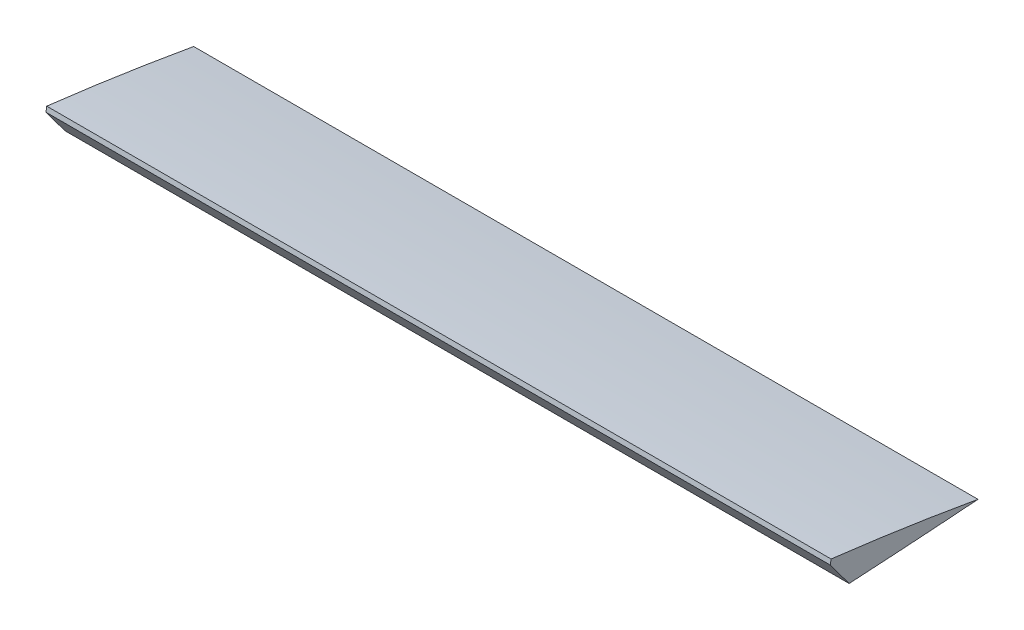
ISO-10303-21;
HEADER;
FILE_DESCRIPTION(('STEP AP214'),'2;1');
FILE_NAME('part.step','',(''),(''),'','','');
FILE_SCHEMA(('AUTOMOTIVE_DESIGN { 1 0 10303 214 1 1 1 1 }'));
ENDSEC;
DATA;
#1=APPLICATION_CONTEXT('core data for automotive mechanical design processes');
#2=APPLICATION_PROTOCOL_DEFINITION('international standard','automotive_design',2000,#1);
#3=PRODUCT_CONTEXT('',#1,'mechanical');
#4=PRODUCT('Part','Part','',(#3));
#5=PRODUCT_RELATED_PRODUCT_CATEGORY('part','',(#4));
#6=PRODUCT_DEFINITION_FORMATION('','',#4);
#7=PRODUCT_DEFINITION_CONTEXT('part definition',#1,'design');
#8=PRODUCT_DEFINITION('design','',#6,#7);
#9=PRODUCT_DEFINITION_SHAPE('','',#8);
#10=(LENGTH_UNIT() NAMED_UNIT(*) SI_UNIT(.MILLI.,.METRE.));
#11=(NAMED_UNIT(*) PLANE_ANGLE_UNIT() SI_UNIT($,.RADIAN.));
#12=(NAMED_UNIT(*) SI_UNIT($,.STERADIAN.) SOLID_ANGLE_UNIT());
#13=UNCERTAINTY_MEASURE_WITH_UNIT(LENGTH_MEASURE(1.E-05),#10,'distance_accuracy_value','');
#14=(GEOMETRIC_REPRESENTATION_CONTEXT(3) GLOBAL_UNCERTAINTY_ASSIGNED_CONTEXT((#13)) GLOBAL_UNIT_ASSIGNED_CONTEXT((#10,
#11,#12)) REPRESENTATION_CONTEXT('',''));
#15=CARTESIAN_POINT('',(0.,0.,0.));
#16=DIRECTION('',(0.,0.,1.));
#17=DIRECTION('',(1.,0.,0.));
#18=AXIS2_PLACEMENT_3D('',#15,#16,#17);
#19=CARTESIAN_POINT('',(-187.325,3467.35220178004,189.415651011113));
#20=DIRECTION('',(1.,0.,0.));
#21=DIRECTION('',(0.,0.,-1.));
#22=AXIS2_PLACEMENT_3D('',#19,#20,#21);
#23=CYLINDRICAL_SURFACE('',#22,3487.44198261828);
#24=CARTESIAN_POINT('',(187.325,3467.35220178004,189.415651011113));
#25=DIRECTION('',(-1.,0.,0.));
#26=DIRECTION('',(0.,0.,1.));
#27=AXIS2_PLACEMENT_3D('',#24,#25,#26);
#28=CIRCLE('',#27,3487.44198261828);
#29=CARTESIAN_POINT('',(187.325,-10.4138152048303,-70.1900369729345));
#30=VERTEX_POINT('',#29);
#31=CARTESIAN_POINT('',(187.325,-14.4619784667253,-8.62877925903338));
#32=VERTEX_POINT('',#31);
#33=EDGE_CURVE('E89',#30,#32,#28,.T.);
#34=ORIENTED_EDGE('',*,*,#33,.T.);
#35=DIRECTION('',(1.,0.,0.));
#36=VECTOR('',#35,1.);
#37=CARTESIAN_POINT('',(-187.325,-14.4619784667248,-8.62877925903316));
#38=LINE('',#37,#36);
#39=CARTESIAN_POINT('',(-187.325,-14.4619784667248,-8.62877925903316));
#40=VERTEX_POINT('',#39);
#41=EDGE_CURVE('E54',#40,#32,#38,.T.);
#42=ORIENTED_EDGE('',*,*,#41,.F.);
#43=CARTESIAN_POINT('',(-187.325,3467.35220178004,189.415651011113));
#44=DIRECTION('',(-1.,0.,0.));
#45=DIRECTION('',(0.,0.,1.));
#46=AXIS2_PLACEMENT_3D('',#43,#44,#45);
#47=CIRCLE('',#46,3487.44198261828);
#48=CARTESIAN_POINT('',(-187.325,-10.4138152048303,-70.1900369729345));
#49=VERTEX_POINT('',#48);
#50=EDGE_CURVE('E84',#49,#40,#47,.T.);
#51=ORIENTED_EDGE('',*,*,#50,.F.);
#52=DIRECTION('',(1.,0.,0.));
#53=VECTOR('',#52,1.);
#54=CARTESIAN_POINT('',(-187.325,-10.4138152048303,-70.1900369729345));
#55=LINE('',#54,#53);
#56=EDGE_CURVE('E47',#49,#30,#55,.T.);
#57=ORIENTED_EDGE('',*,*,#56,.T.);
#58=EDGE_LOOP('',(#34,#42,#51,#57));
#59=FACE_BOUND('',#58,.T.);
#60=ADVANCED_FACE('F39',(#59),#23,.T.);
#61=CARTESIAN_POINT('',(-187.325,0.,0.));
#62=DIRECTION('',(0.,-0.146759519125399,-0.989172201159172));
#63=DIRECTION('',(0.,0.989172201159172,-0.146759519125399));
#64=AXIS2_PLACEMENT_3D('',#61,#62,#63);
#65=PLANE('',#64);
#66=DIRECTION('',(0.,0.989172201159172,-0.146759519125399));
#67=VECTOR('',#66,1.);
#68=CARTESIAN_POINT('',(-187.325,0.,0.));
#69=LINE('',#68,#67);
#70=CARTESIAN_POINT('',(-187.325,-2.35546630401006,0.349471104917352));
#71=VERTEX_POINT('',#70);
#72=CARTESIAN_POINT('',(-187.325,2.22044604925031E-13,0.));
#73=VERTEX_POINT('',#72);
#74=EDGE_CURVE('E105',#71,#73,#69,.T.);
#75=ORIENTED_EDGE('',*,*,#74,.F.);
#76=DIRECTION('',(1.,0.,0.));
#77=VECTOR('',#76,1.);
#78=CARTESIAN_POINT('',(-187.325,-2.35546630401006,0.349471104917352));
#79=LINE('',#78,#77);
#80=CARTESIAN_POINT('',(187.325,-2.35546630401006,0.349471104917352));
#81=VERTEX_POINT('',#80);
#82=EDGE_CURVE('E94',#71,#81,#79,.T.);
#83=ORIENTED_EDGE('',*,*,#82,.T.);
#84=DIRECTION('',(0.,0.989172201159172,-0.146759519125399));
#85=VECTOR('',#84,1.);
#86=CARTESIAN_POINT('',(187.325,0.,0.));
#87=LINE('',#86,#85);
#88=CARTESIAN_POINT('',(187.325,2.22044604925031E-13,0.));
#89=VERTEX_POINT('',#88);
#90=EDGE_CURVE('E85',#81,#89,#87,.T.);
#91=ORIENTED_EDGE('',*,*,#90,.T.);
#92=DIRECTION('',(1.,0.,0.));
#93=VECTOR('',#92,1.);
#94=CARTESIAN_POINT('',(-187.325,2.22044604925031E-13,0.));
#95=LINE('',#94,#93);
#96=EDGE_CURVE('E11',#73,#89,#95,.T.);
#97=ORIENTED_EDGE('',*,*,#96,.F.);
#98=EDGE_LOOP('',(#75,#83,#91,#97));
#99=FACE_BOUND('',#98,.T.);
#100=ADVANCED_FACE('F120',(#99),#65,.F.);
#101=CARTESIAN_POINT('',(-187.325,-1235.91978924871,147.500932055786));
#102=DIRECTION('',(1.,0.,0.));
#103=DIRECTION('',(0.,0.,-1.));
#104=AXIS2_PLACEMENT_3D('',#101,#102,#103);
#105=CYLINDRICAL_SURFACE('',#104,1244.69042352462);
#106=CARTESIAN_POINT('',(187.325,-1235.91978924871,147.500932055786));
#107=DIRECTION('',(-1.,0.,0.));
#108=DIRECTION('',(0.,0.,-1.));
#109=AXIS2_PLACEMENT_3D('',#106,#107,#108);
#110=CIRCLE('',#109,1244.69042352462);
#111=EDGE_CURVE('E75',#89,#30,#110,.T.);
#112=ORIENTED_EDGE('',*,*,#111,.T.);
#113=ORIENTED_EDGE('',*,*,#56,.F.);
#114=CARTESIAN_POINT('',(-187.325,-1235.91978924871,147.500932055786));
#115=DIRECTION('',(-1.,0.,0.));
#116=DIRECTION('',(0.,0.,-1.));
#117=AXIS2_PLACEMENT_3D('',#114,#115,#116);
#118=CIRCLE('',#117,1244.69042352462);
#119=EDGE_CURVE('E63',#73,#49,#118,.T.);
#120=ORIENTED_EDGE('',*,*,#119,.F.);
#121=ORIENTED_EDGE('',*,*,#96,.T.);
#122=EDGE_LOOP('',(#112,#113,#120,#121));
#123=FACE_BOUND('',#122,.T.);
#124=ADVANCED_FACE('F77',(#123),#105,.T.);
#125=CARTESIAN_POINT('',(-187.325,3467.35220178004,189.415651011113));
#126=DIRECTION('',(-1.,0.,0.));
#127=DIRECTION('',(0.,0.,1.));
#128=AXIS2_PLACEMENT_3D('',#125,#126,#127);
#129=PLANE('',#128);
#130=DIRECTION('',(0.,0.803225022378097,0.59567572002366));
#131=VECTOR('',#130,1.);
#132=CARTESIAN_POINT('',(-187.325,-2.35546630401006,0.349471104917352));
#133=LINE('',#132,#131);
#134=EDGE_CURVE('E109',#40,#71,#133,.T.);
#135=ORIENTED_EDGE('',*,*,#134,.T.);
#136=ORIENTED_EDGE('',*,*,#74,.T.);
#137=ORIENTED_EDGE('',*,*,#119,.T.);
#138=ORIENTED_EDGE('',*,*,#50,.T.);
#139=EDGE_LOOP('',(#135,#136,#137,#138));
#140=FACE_BOUND('',#139,.T.);
#141=ADVANCED_FACE('F121',(#140),#129,.T.);
#142=CARTESIAN_POINT('',(187.325,3467.35220178004,189.415651011113));
#143=DIRECTION('',(-1.,0.,0.));
#144=DIRECTION('',(0.,0.,1.));
#145=AXIS2_PLACEMENT_3D('',#142,#143,#144);
#146=PLANE('',#145);
#147=ORIENTED_EDGE('',*,*,#90,.F.);
#148=DIRECTION('',(0.,0.803225022378097,0.59567572002366));
#149=VECTOR('',#148,1.);
#150=CARTESIAN_POINT('',(187.325,-2.35546630401006,0.349471104917352));
#151=LINE('',#150,#149);
#152=EDGE_CURVE('E92',#32,#81,#151,.T.);
#153=ORIENTED_EDGE('',*,*,#152,.F.);
#154=ORIENTED_EDGE('',*,*,#33,.F.);
#155=ORIENTED_EDGE('',*,*,#111,.F.);
#156=EDGE_LOOP('',(#147,#153,#154,#155));
#157=FACE_BOUND('',#156,.T.);
#158=ADVANCED_FACE('F91',(#157),#146,.F.);
#159=CARTESIAN_POINT('',(-187.325,-2.35546630401006,0.349471104917352));
#160=DIRECTION('',(0.,0.59567572002366,-0.803225022378097));
#161=DIRECTION('',(0.,0.803225022378097,0.59567572002366));
#162=AXIS2_PLACEMENT_3D('',#159,#160,#161);
#163=PLANE('',#162);
#164=ORIENTED_EDGE('',*,*,#82,.F.);
#165=ORIENTED_EDGE('',*,*,#134,.F.);
#166=ORIENTED_EDGE('',*,*,#41,.T.);
#167=ORIENTED_EDGE('',*,*,#152,.T.);
#168=EDGE_LOOP('',(#164,#165,#166,#167));
#169=FACE_BOUND('',#168,.T.);
#170=ADVANCED_FACE('F115',(#169),#163,.F.);
#171=CLOSED_SHELL('',(#60,#100,#124,#141,#158,#170));
#172=MANIFOLD_SOLID_BREP('B2',#171);
#173=ADVANCED_BREP_SHAPE_REPRESENTATION('',(#18,#172),#14);
#174=SHAPE_DEFINITION_REPRESENTATION(#9,#173);
ENDSEC;
END-ISO-10303-21;
